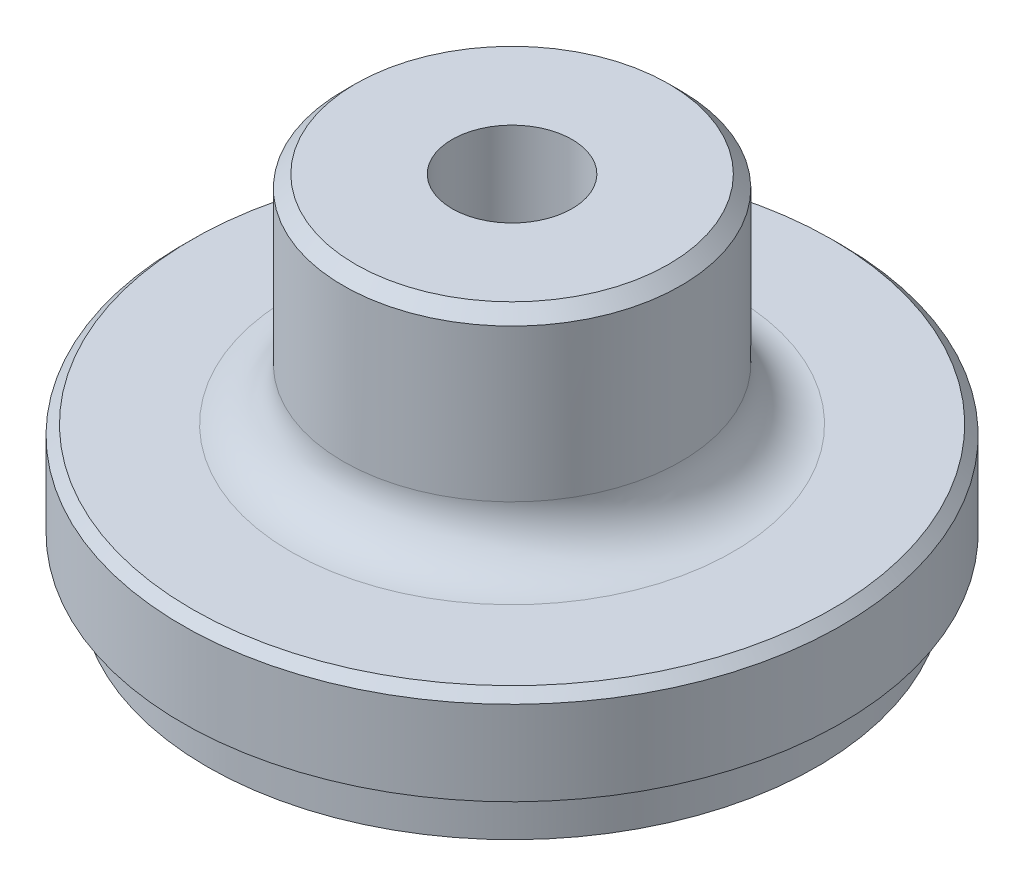
ISO-10303-21;
HEADER;
FILE_DESCRIPTION(('STEP AP214'),'2;1');
FILE_NAME('part.step','',(''),(''),'','','');
FILE_SCHEMA(('AUTOMOTIVE_DESIGN { 1 0 10303 214 1 1 1 1 }'));
ENDSEC;
DATA;
#1=APPLICATION_CONTEXT('core data for automotive mechanical design processes');
#2=APPLICATION_PROTOCOL_DEFINITION('international standard','automotive_design',2000,#1);
#3=PRODUCT_CONTEXT('',#1,'mechanical');
#4=PRODUCT('Part','Part','',(#3));
#5=PRODUCT_RELATED_PRODUCT_CATEGORY('part','',(#4));
#6=PRODUCT_DEFINITION_FORMATION('','',#4);
#7=PRODUCT_DEFINITION_CONTEXT('part definition',#1,'design');
#8=PRODUCT_DEFINITION('design','',#6,#7);
#9=PRODUCT_DEFINITION_SHAPE('','',#8);
#10=(LENGTH_UNIT() NAMED_UNIT(*) SI_UNIT(.MILLI.,.METRE.));
#11=(NAMED_UNIT(*) PLANE_ANGLE_UNIT() SI_UNIT($,.RADIAN.));
#12=(NAMED_UNIT(*) SI_UNIT($,.STERADIAN.) SOLID_ANGLE_UNIT());
#13=UNCERTAINTY_MEASURE_WITH_UNIT(LENGTH_MEASURE(1.E-05),#10,'distance_accuracy_value','');
#14=(GEOMETRIC_REPRESENTATION_CONTEXT(3) GLOBAL_UNCERTAINTY_ASSIGNED_CONTEXT((#13)) GLOBAL_UNIT_ASSIGNED_CONTEXT((#10,
#11,#12)) REPRESENTATION_CONTEXT('',''));
#15=CARTESIAN_POINT('',(0.,0.,0.));
#16=DIRECTION('',(0.,0.,1.));
#17=DIRECTION('',(1.,0.,0.));
#18=AXIS2_PLACEMENT_3D('',#15,#16,#17);
#19=CARTESIAN_POINT('',(0.,38.05,0.));
#20=DIRECTION('',(0.,-1.,0.));
#21=DIRECTION('',(0.,0.,-1.));
#22=AXIS2_PLACEMENT_3D('',#19,#20,#21);
#23=CONICAL_SURFACE('',#22,16.5,0.785398163397448);
#24=CARTESIAN_POINT('',(0.,38.05,0.));
#25=DIRECTION('',(0.,1.,0.));
#26=DIRECTION('',(0.,0.,1.));
#27=AXIS2_PLACEMENT_3D('',#24,#25,#26);
#28=CIRCLE('',#27,16.5);
#29=CARTESIAN_POINT('',(0.,38.05,16.5));
#30=VERTEX_POINT('',#29);
#31=EDGE_CURVE('E51',#30,#30,#28,.T.);
#32=ORIENTED_EDGE('',*,*,#31,.F.);
#33=EDGE_LOOP('',(#32));
#34=FACE_BOUND('',#33,.T.);
#35=CARTESIAN_POINT('',(0.,36.75,0.));
#36=DIRECTION('',(0.,1.,0.));
#37=DIRECTION('',(0.,0.,1.));
#38=AXIS2_PLACEMENT_3D('',#35,#36,#37);
#39=CIRCLE('',#38,17.8);
#40=CARTESIAN_POINT('',(0.,36.75,-17.8));
#41=VERTEX_POINT('',#40);
#42=EDGE_CURVE('E47',#41,#41,#39,.F.);
#43=ORIENTED_EDGE('',*,*,#42,.F.);
#44=EDGE_LOOP('',(#43));
#45=FACE_BOUND('',#44,.T.);
#46=ADVANCED_FACE('F36',(#34,#45),#23,.T.);
#47=CARTESIAN_POINT('',(0.,20.7,0.));
#48=DIRECTION('',(0.,1.,0.));
#49=DIRECTION('',(0.,0.,1.));
#50=AXIS2_PLACEMENT_3D('',#47,#48,#49);
#51=TOROIDAL_SURFACE('',#50,23.3,5.5);
#52=CARTESIAN_POINT('',(0.,20.7,0.));
#53=DIRECTION('',(0.,1.,0.));
#54=DIRECTION('',(0.,0.,1.));
#55=AXIS2_PLACEMENT_3D('',#52,#53,#54);
#56=CIRCLE('',#55,17.8);
#57=CARTESIAN_POINT('',(0.,20.7,-17.8));
#58=VERTEX_POINT('',#57);
#59=EDGE_CURVE('E59',#58,#58,#56,.T.);
#60=ORIENTED_EDGE('',*,*,#59,.F.);
#61=EDGE_LOOP('',(#60));
#62=FACE_BOUND('',#61,.T.);
#63=CARTESIAN_POINT('',(0.,15.2,0.));
#64=DIRECTION('',(0.,1.,0.));
#65=DIRECTION('',(0.,0.,1.));
#66=AXIS2_PLACEMENT_3D('',#63,#64,#65);
#67=CIRCLE('',#66,23.3);
#68=CARTESIAN_POINT('',(0.,15.2,23.3));
#69=VERTEX_POINT('',#68);
#70=EDGE_CURVE('E56',#69,#69,#67,.F.);
#71=ORIENTED_EDGE('',*,*,#70,.F.);
#72=EDGE_LOOP('',(#71));
#73=FACE_BOUND('',#72,.T.);
#74=ADVANCED_FACE('F98',(#62,#73),#51,.F.);
#75=CARTESIAN_POINT('',(0.,5.3,0.));
#76=DIRECTION('',(0.,-1.,0.));
#77=DIRECTION('',(0.,0.,-1.));
#78=AXIS2_PLACEMENT_3D('',#75,#76,#77);
#79=CYLINDRICAL_SURFACE('',#78,32.15);
#80=CARTESIAN_POINT('',(0.,5.3,0.));
#81=DIRECTION('',(0.,1.,0.));
#82=DIRECTION('',(0.,0.,1.));
#83=AXIS2_PLACEMENT_3D('',#80,#81,#82);
#84=CIRCLE('',#83,32.15);
#85=CARTESIAN_POINT('',(0.,5.3,32.15));
#86=VERTEX_POINT('',#85);
#87=EDGE_CURVE('E62',#86,#86,#84,.T.);
#88=ORIENTED_EDGE('',*,*,#87,.F.);
#89=EDGE_LOOP('',(#88));
#90=FACE_BOUND('',#89,.T.);
#91=CARTESIAN_POINT('',(0.,0.,0.));
#92=DIRECTION('',(0.,1.,0.));
#93=DIRECTION('',(0.,0.,1.));
#94=AXIS2_PLACEMENT_3D('',#91,#92,#93);
#95=CIRCLE('',#94,32.15);
#96=CARTESIAN_POINT('',(0.,0.,32.15));
#97=VERTEX_POINT('',#96);
#98=EDGE_CURVE('E63',#97,#97,#95,.T.);
#99=ORIENTED_EDGE('',*,*,#98,.T.);
#100=EDGE_LOOP('',(#99));
#101=FACE_BOUND('',#100,.T.);
#102=ADVANCED_FACE('F103',(#90,#101),#79,.T.);
#103=CARTESIAN_POINT('',(0.,0.,0.));
#104=DIRECTION('',(0.,1.,0.));
#105=DIRECTION('',(0.,0.,1.));
#106=AXIS2_PLACEMENT_3D('',#103,#104,#105);
#107=PLANE('',#106);
#108=ORIENTED_EDGE('',*,*,#98,.F.);
#109=EDGE_LOOP('',(#108));
#110=FACE_BOUND('',#109,.T.);
#111=ADVANCED_FACE('F111',(#110),#107,.F.);
#112=CARTESIAN_POINT('',(0.,15.2,0.));
#113=DIRECTION('',(0.,-1.,0.));
#114=DIRECTION('',(0.,0.,-1.));
#115=AXIS2_PLACEMENT_3D('',#112,#113,#114);
#116=CYLINDRICAL_SURFACE('',#115,34.75);
#117=CARTESIAN_POINT('',(0.,14.2,0.));
#118=DIRECTION('',(0.,1.,0.));
#119=DIRECTION('',(0.,0.,1.));
#120=AXIS2_PLACEMENT_3D('',#117,#118,#119);
#121=CIRCLE('',#120,34.75);
#122=CARTESIAN_POINT('',(0.,14.2,-34.75));
#123=VERTEX_POINT('',#122);
#124=EDGE_CURVE('E12',#123,#123,#121,.F.);
#125=CARTESIAN_POINT('',(0.,5.3,0.));
#126=DIRECTION('',(0.,1.,0.));
#127=DIRECTION('',(0.,0.,1.));
#128=AXIS2_PLACEMENT_3D('',#125,#126,#127);
#129=CIRCLE('',#128,34.75);
#130=CARTESIAN_POINT('',(0.,5.3,-34.75));
#131=VERTEX_POINT('',#130);
#132=EDGE_CURVE('E66',#131,#131,#129,.T.);
#133=CARTESIAN_POINT('',(0.,14.2,-34.75));
#134=CARTESIAN_POINT('',(0.,14.1072916666667,-34.75));
#135=CARTESIAN_POINT('',(0.,14.0145833333334,-34.75));
#136=CARTESIAN_POINT('',(0.,13.8291666666667,-34.75));
#137=CARTESIAN_POINT('',(0.,13.7364583333334,-34.75));
#138=CARTESIAN_POINT('',(0.,13.5510416666667,-34.75));
#139=CARTESIAN_POINT('',(0.,13.4583333333334,-34.75));
#140=CARTESIAN_POINT('',(0.,13.2729166666667,-34.75));
#141=CARTESIAN_POINT('',(0.,13.1802083333334,-34.75));
#142=CARTESIAN_POINT('',(0.,12.9947916666667,-34.75));
#143=CARTESIAN_POINT('',(0.,12.9020833333334,-34.75));
#144=CARTESIAN_POINT('',(0.,12.7166666666667,-34.75));
#145=CARTESIAN_POINT('',(0.,12.6239583333334,-34.75));
#146=CARTESIAN_POINT('',(0.,12.4385416666667,-34.75));
#147=CARTESIAN_POINT('',(0.,12.3458333333334,-34.75));
#148=CARTESIAN_POINT('',(0.,12.1604166666667,-34.75));
#149=CARTESIAN_POINT('',(0.,12.0677083333334,-34.75));
#150=CARTESIAN_POINT('',(0.,11.8822916666667,-34.75));
#151=CARTESIAN_POINT('',(0.,11.7895833333334,-34.75));
#152=CARTESIAN_POINT('',(0.,11.6041666666667,-34.75));
#153=CARTESIAN_POINT('',(0.,11.5114583333334,-34.75));
#154=CARTESIAN_POINT('',(0.,11.3260416666667,-34.75));
#155=CARTESIAN_POINT('',(0.,11.2333333333334,-34.75));
#156=CARTESIAN_POINT('',(0.,11.0479166666667,-34.75));
#157=CARTESIAN_POINT('',(0.,10.9552083333334,-34.75));
#158=CARTESIAN_POINT('',(0.,10.7697916666667,-34.75));
#159=CARTESIAN_POINT('',(0.,10.6770833333334,-34.75));
#160=CARTESIAN_POINT('',(0.,10.4916666666667,-34.75));
#161=CARTESIAN_POINT('',(0.,10.3989583333334,-34.75));
#162=CARTESIAN_POINT('',(0.,10.2135416666667,-34.75));
#163=CARTESIAN_POINT('',(0.,10.1208333333334,-34.75));
#164=CARTESIAN_POINT('',(0.,9.93541666666669,-34.75));
#165=CARTESIAN_POINT('',(0.,9.84270833333336,-34.75));
#166=CARTESIAN_POINT('',(0.,9.65729166666669,-34.75));
#167=CARTESIAN_POINT('',(0.,9.56458333333336,-34.75));
#168=CARTESIAN_POINT('',(0.,9.37916666666669,-34.75));
#169=CARTESIAN_POINT('',(0.,9.28645833333336,-34.75));
#170=CARTESIAN_POINT('',(0.,9.10104166666669,-34.75));
#171=CARTESIAN_POINT('',(0.,9.00833333333335,-34.75));
#172=CARTESIAN_POINT('',(0.,8.82291666666669,-34.75));
#173=CARTESIAN_POINT('',(0.,8.73020833333335,-34.75));
#174=CARTESIAN_POINT('',(0.,8.54479166666668,-34.75));
#175=CARTESIAN_POINT('',(0.,8.45208333333335,-34.75));
#176=CARTESIAN_POINT('',(0.,8.26666666666668,-34.75));
#177=CARTESIAN_POINT('',(0.,8.17395833333335,-34.75));
#178=CARTESIAN_POINT('',(0.,7.98854166666668,-34.75));
#179=CARTESIAN_POINT('',(0.,7.89583333333335,-34.75));
#180=CARTESIAN_POINT('',(0.,7.71041666666668,-34.75));
#181=CARTESIAN_POINT('',(0.,7.61770833333335,-34.75));
#182=CARTESIAN_POINT('',(0.,7.43229166666668,-34.75));
#183=CARTESIAN_POINT('',(0.,7.33958333333335,-34.75));
#184=CARTESIAN_POINT('',(0.,7.15416666666668,-34.75));
#185=CARTESIAN_POINT('',(0.,7.06145833333334,-34.75));
#186=CARTESIAN_POINT('',(0.,6.87604166666668,-34.75));
#187=CARTESIAN_POINT('',(0.,6.78333333333334,-34.75));
#188=CARTESIAN_POINT('',(0.,6.59791666666667,-34.75));
#189=CARTESIAN_POINT('',(0.,6.50520833333334,-34.75));
#190=CARTESIAN_POINT('',(0.,6.31979166666667,-34.75));
#191=CARTESIAN_POINT('',(0.,6.22708333333334,-34.75));
#192=CARTESIAN_POINT('',(0.,6.04166666666667,-34.75));
#193=CARTESIAN_POINT('',(0.,5.94895833333334,-34.75));
#194=CARTESIAN_POINT('',(0.,5.76354166666667,-34.75));
#195=CARTESIAN_POINT('',(0.,5.67083333333334,-34.75));
#196=CARTESIAN_POINT('',(0.,5.48541666666667,-34.75));
#197=CARTESIAN_POINT('',(0.,5.39270833333333,-34.75));
#198=CARTESIAN_POINT('',(0.,5.3,-34.75));
#199=B_SPLINE_CURVE_WITH_KNOTS('',3,(#133,#134,#135,#136,#137,#138,#139,#140,#141,#142,#143,
#144,#145,#146,#147,#148,#149,#150,#151,#152,#153,#154,#155,#156,#157,#158,#159,#160,#161,#162,
#163,#164,#165,#166,#167,#168,#169,#170,#171,#172,#173,#174,#175,#176,#177,#178,#179,#180,#181,
#182,#183,#184,#185,#186,#187,#188,#189,#190,#191,#192,#193,#194,#195,#196,#197,#198),
.UNSPECIFIED.,.F.,.F.,(4,2,2,2,2,2,2,2,2,2,2,2,2,2,2,2,2,2,2,2,2,2,2,2,2,2,2,2,2,2,2,2,4),(0.,
0.278125000000001,0.556250000000003,0.834375000000004,1.11250000000001,1.39062500000001,
1.66875000000001,1.94687500000001,2.22500000000001,2.50312500000001,2.78125000000001,
3.05937500000002,3.33750000000002,3.61562500000002,3.89375000000002,4.17187500000002,
4.45000000000002,4.72812500000003,5.00625000000003,5.28437500000003,5.56250000000003,
5.84062500000003,6.11875000000003,6.39687500000003,6.67500000000004,6.95312500000004,
7.23125000000004,7.50937500000004,7.78750000000004,8.06562500000004,8.34375000000004,
8.62187500000004,8.90000000000005),.UNSPECIFIED.);
#200=EDGE_CURVE('BSEAM115',#123,#131,#199,.T.);
#201=ORIENTED_EDGE('',*,*,#124,.T.);
#202=ORIENTED_EDGE('',*,*,#132,.T.);
#203=ORIENTED_EDGE('',*,*,#200,.T.);
#204=ORIENTED_EDGE('',*,*,#200,.F.);
#205=EDGE_LOOP('',(#201,#203,#202,#204));
#206=FACE_BOUND('',#205,.T.);
#207=ADVANCED_FACE('F115',(#206),#116,.T.);
#208=CARTESIAN_POINT('',(0.,15.2,0.));
#209=DIRECTION('',(0.,1.,0.));
#210=DIRECTION('',(0.,0.,1.));
#211=AXIS2_PLACEMENT_3D('',#208,#209,#210);
#212=PLANE('',#211);
#213=CARTESIAN_POINT('',(0.,15.2,0.));
#214=DIRECTION('',(0.,1.,0.));
#215=DIRECTION('',(0.,0.,1.));
#216=AXIS2_PLACEMENT_3D('',#213,#214,#215);
#217=CIRCLE('',#216,33.75);
#218=CARTESIAN_POINT('',(0.,15.2,33.75));
#219=VERTEX_POINT('',#218);
#220=EDGE_CURVE('E43',#219,#219,#217,.T.);
#221=ORIENTED_EDGE('',*,*,#220,.T.);
#222=EDGE_LOOP('',(#221));
#223=FACE_BOUND('',#222,.T.);
#224=ORIENTED_EDGE('',*,*,#70,.T.);
#225=EDGE_LOOP('',(#224));
#226=FACE_BOUND('',#225,.T.);
#227=ADVANCED_FACE('F119',(#223,#226),#212,.T.);
#228=CARTESIAN_POINT('',(0.,5.3,0.));
#229=DIRECTION('',(0.,1.,0.));
#230=DIRECTION('',(0.,0.,1.));
#231=AXIS2_PLACEMENT_3D('',#228,#229,#230);
#232=PLANE('',#231);
#233=ORIENTED_EDGE('',*,*,#87,.T.);
#234=EDGE_LOOP('',(#233));
#235=FACE_BOUND('',#234,.T.);
#236=ORIENTED_EDGE('',*,*,#132,.F.);
#237=EDGE_LOOP('',(#236));
#238=FACE_BOUND('',#237,.T.);
#239=ADVANCED_FACE('F94',(#235,#238),#232,.F.);
#240=CARTESIAN_POINT('',(0.,38.05,0.));
#241=DIRECTION('',(0.,-1.,0.));
#242=DIRECTION('',(0.,0.,-1.));
#243=AXIS2_PLACEMENT_3D('',#240,#241,#242);
#244=CYLINDRICAL_SURFACE('',#243,17.8);
#245=CARTESIAN_POINT('',(0.,36.75,-17.8));
#246=CARTESIAN_POINT('',(0.,36.5828125,-17.8));
#247=CARTESIAN_POINT('',(0.,36.415625,-17.8));
#248=CARTESIAN_POINT('',(0.,36.08125,-17.8));
#249=CARTESIAN_POINT('',(0.,35.9140625,-17.8));
#250=CARTESIAN_POINT('',(0.,35.5796875,-17.8));
#251=CARTESIAN_POINT('',(0.,35.4125,-17.8));
#252=CARTESIAN_POINT('',(0.,35.078125,-17.8));
#253=CARTESIAN_POINT('',(0.,34.9109375,-17.8));
#254=CARTESIAN_POINT('',(0.,34.5765625,-17.8));
#255=CARTESIAN_POINT('',(0.,34.409375,-17.8));
#256=CARTESIAN_POINT('',(0.,34.075,-17.8));
#257=CARTESIAN_POINT('',(0.,33.9078125,-17.8));
#258=CARTESIAN_POINT('',(0.,33.5734375,-17.8));
#259=CARTESIAN_POINT('',(0.,33.40625,-17.8));
#260=CARTESIAN_POINT('',(0.,33.071875,-17.8));
#261=CARTESIAN_POINT('',(0.,32.9046875,-17.8));
#262=CARTESIAN_POINT('',(0.,32.5703125,-17.8));
#263=CARTESIAN_POINT('',(0.,32.403125,-17.8));
#264=CARTESIAN_POINT('',(0.,32.06875,-17.8));
#265=CARTESIAN_POINT('',(0.,31.9015625,-17.8));
#266=CARTESIAN_POINT('',(0.,31.5671875,-17.8));
#267=CARTESIAN_POINT('',(0.,31.4,-17.8));
#268=CARTESIAN_POINT('',(0.,31.065625,-17.8));
#269=CARTESIAN_POINT('',(0.,30.8984375,-17.8));
#270=CARTESIAN_POINT('',(0.,30.5640625,-17.8));
#271=CARTESIAN_POINT('',(0.,30.396875,-17.8));
#272=CARTESIAN_POINT('',(0.,30.0625,-17.8));
#273=CARTESIAN_POINT('',(0.,29.8953125,-17.8));
#274=CARTESIAN_POINT('',(0.,29.5609375,-17.8));
#275=CARTESIAN_POINT('',(0.,29.39375,-17.8));
#276=CARTESIAN_POINT('',(0.,29.059375,-17.8));
#277=CARTESIAN_POINT('',(0.,28.8921875,-17.8));
#278=CARTESIAN_POINT('',(0.,28.5578125,-17.8));
#279=CARTESIAN_POINT('',(0.,28.390625,-17.8));
#280=CARTESIAN_POINT('',(0.,28.05625,-17.8));
#281=CARTESIAN_POINT('',(0.,27.8890625,-17.8));
#282=CARTESIAN_POINT('',(0.,27.5546875,-17.8));
#283=CARTESIAN_POINT('',(0.,27.3875,-17.8));
#284=CARTESIAN_POINT('',(0.,27.053125,-17.8));
#285=CARTESIAN_POINT('',(0.,26.8859375,-17.8));
#286=CARTESIAN_POINT('',(0.,26.5515625,-17.8));
#287=CARTESIAN_POINT('',(0.,26.384375,-17.8));
#288=CARTESIAN_POINT('',(0.,26.05,-17.8));
#289=CARTESIAN_POINT('',(0.,25.8828125,-17.8));
#290=CARTESIAN_POINT('',(0.,25.5484375,-17.8));
#291=CARTESIAN_POINT('',(0.,25.38125,-17.8));
#292=CARTESIAN_POINT('',(0.,25.046875,-17.8));
#293=CARTESIAN_POINT('',(0.,24.8796875,-17.8));
#294=CARTESIAN_POINT('',(0.,24.5453125,-17.8));
#295=CARTESIAN_POINT('',(0.,24.378125,-17.8));
#296=CARTESIAN_POINT('',(0.,24.04375,-17.8));
#297=CARTESIAN_POINT('',(0.,23.8765625,-17.8));
#298=CARTESIAN_POINT('',(0.,23.5421875,-17.8));
#299=CARTESIAN_POINT('',(0.,23.375,-17.8));
#300=CARTESIAN_POINT('',(0.,23.040625,-17.8));
#301=CARTESIAN_POINT('',(0.,22.8734375,-17.8));
#302=CARTESIAN_POINT('',(0.,22.5390625,-17.8));
#303=CARTESIAN_POINT('',(0.,22.371875,-17.8));
#304=CARTESIAN_POINT('',(0.,22.0375,-17.8));
#305=CARTESIAN_POINT('',(0.,21.8703125,-17.8));
#306=CARTESIAN_POINT('',(0.,21.5359375,-17.8));
#307=CARTESIAN_POINT('',(0.,21.36875,-17.8));
#308=CARTESIAN_POINT('',(0.,21.034375,-17.8));
#309=CARTESIAN_POINT('',(0.,20.8671875,-17.8));
#310=CARTESIAN_POINT('',(0.,20.7,-17.8));
#311=B_SPLINE_CURVE_WITH_KNOTS('',3,(#245,#246,#247,#248,#249,#250,#251,#252,#253,#254,#255,
#256,#257,#258,#259,#260,#261,#262,#263,#264,#265,#266,#267,#268,#269,#270,#271,#272,#273,#274,
#275,#276,#277,#278,#279,#280,#281,#282,#283,#284,#285,#286,#287,#288,#289,#290,#291,#292,#293,
#294,#295,#296,#297,#298,#299,#300,#301,#302,#303,#304,#305,#306,#307,#308,#309,#310),
.UNSPECIFIED.,.F.,.F.,(4,2,2,2,2,2,2,2,2,2,2,2,2,2,2,2,2,2,2,2,2,2,2,2,2,2,2,2,2,2,2,2,4),(0.,
0.501562500000004,1.003125,1.5046875,2.00625,2.5078125,3.009375,3.51093750000001,4.0125,
4.51406250000001,5.015625,5.5171875,6.01875,6.5203125,7.021875,7.5234375,8.025,8.5265625,
9.028125,9.5296875,10.03125,10.5328125,11.034375,11.5359375,12.0375,12.5390625,13.040625,
13.5421875,14.04375,14.5453125,15.046875,15.5484375,16.05),.UNSPECIFIED.);
#312=EDGE_CURVE('BSEAM88',#41,#58,#311,.T.);
#313=ORIENTED_EDGE('',*,*,#42,.T.);
#314=ORIENTED_EDGE('',*,*,#59,.T.);
#315=ORIENTED_EDGE('',*,*,#312,.T.);
#316=ORIENTED_EDGE('',*,*,#312,.F.);
#317=EDGE_LOOP('',(#313,#315,#314,#316));
#318=FACE_BOUND('',#317,.T.);
#319=ADVANCED_FACE('F88',(#318),#244,.T.);
#320=CARTESIAN_POINT('',(0.,38.05,0.));
#321=DIRECTION('',(0.,1.,0.));
#322=DIRECTION('',(0.,0.,1.));
#323=AXIS2_PLACEMENT_3D('',#320,#321,#322);
#324=PLANE('',#323);
#325=ORIENTED_EDGE('',*,*,#31,.T.);
#326=EDGE_LOOP('',(#325));
#327=FACE_BOUND('',#326,.T.);
#328=CARTESIAN_POINT('',(0.,38.05,0.));
#329=DIRECTION('',(0.,1.,0.));
#330=DIRECTION('',(0.,0.,1.));
#331=AXIS2_PLACEMENT_3D('',#328,#329,#330);
#332=CIRCLE('',#331,6.325);
#333=CARTESIAN_POINT('',(0.,38.05,6.325));
#334=VERTEX_POINT('',#333);
#335=EDGE_CURVE('E72',#334,#334,#332,.T.);
#336=ORIENTED_EDGE('',*,*,#335,.F.);
#337=EDGE_LOOP('',(#336));
#338=FACE_BOUND('',#337,.T.);
#339=ADVANCED_FACE('F83',(#327,#338),#324,.T.);
#340=CARTESIAN_POINT('',(0.,12.65,0.));
#341=DIRECTION('',(0.,1.,0.));
#342=DIRECTION('',(0.,0.,1.));
#343=AXIS2_PLACEMENT_3D('',#340,#341,#342);
#344=CYLINDRICAL_SURFACE('',#343,6.325);
#345=CARTESIAN_POINT('',(0.,12.65,0.));
#346=DIRECTION('',(0.,1.,0.));
#347=DIRECTION('',(0.,0.,1.));
#348=AXIS2_PLACEMENT_3D('',#345,#346,#347);
#349=CIRCLE('',#348,6.325);
#350=CARTESIAN_POINT('',(0.,12.65,6.325));
#351=VERTEX_POINT('',#350);
#352=EDGE_CURVE('E71',#351,#351,#349,.T.);
#353=ORIENTED_EDGE('',*,*,#352,.F.);
#354=EDGE_LOOP('',(#353));
#355=FACE_BOUND('',#354,.T.);
#356=ORIENTED_EDGE('',*,*,#335,.T.);
#357=EDGE_LOOP('',(#356));
#358=FACE_BOUND('',#357,.T.);
#359=ADVANCED_FACE('F80',(#355,#358),#344,.F.);
#360=CARTESIAN_POINT('',(0.,12.65,0.));
#361=DIRECTION('',(0.,1.,0.));
#362=DIRECTION('',(0.,0.,1.));
#363=AXIS2_PLACEMENT_3D('',#360,#361,#362);
#364=PLANE('',#363);
#365=ORIENTED_EDGE('',*,*,#352,.T.);
#366=EDGE_LOOP('',(#365));
#367=FACE_BOUND('',#366,.T.);
#368=ADVANCED_FACE('F78',(#367),#364,.T.);
#369=CARTESIAN_POINT('',(0.,15.2,0.));
#370=DIRECTION('',(0.,-1.,0.));
#371=DIRECTION('',(0.,0.,-1.));
#372=AXIS2_PLACEMENT_3D('',#369,#370,#371);
#373=CONICAL_SURFACE('',#372,33.75,0.785398163397448);
#374=ORIENTED_EDGE('',*,*,#124,.F.);
#375=EDGE_LOOP('',(#374));
#376=FACE_BOUND('',#375,.T.);
#377=ORIENTED_EDGE('',*,*,#220,.F.);
#378=EDGE_LOOP('',(#377));
#379=FACE_BOUND('',#378,.T.);
#380=ADVANCED_FACE('F38',(#376,#379),#373,.T.);
#381=CLOSED_SHELL('',(#46,#74,#102,#111,#207,#227,#239,#319,#339,#359,#368,#380));
#382=MANIFOLD_SOLID_BREP('B2',#381);
#383=ADVANCED_BREP_SHAPE_REPRESENTATION('',(#18,#382),#14);
#384=SHAPE_DEFINITION_REPRESENTATION(#9,#383);
ENDSEC;
END-ISO-10303-21;
